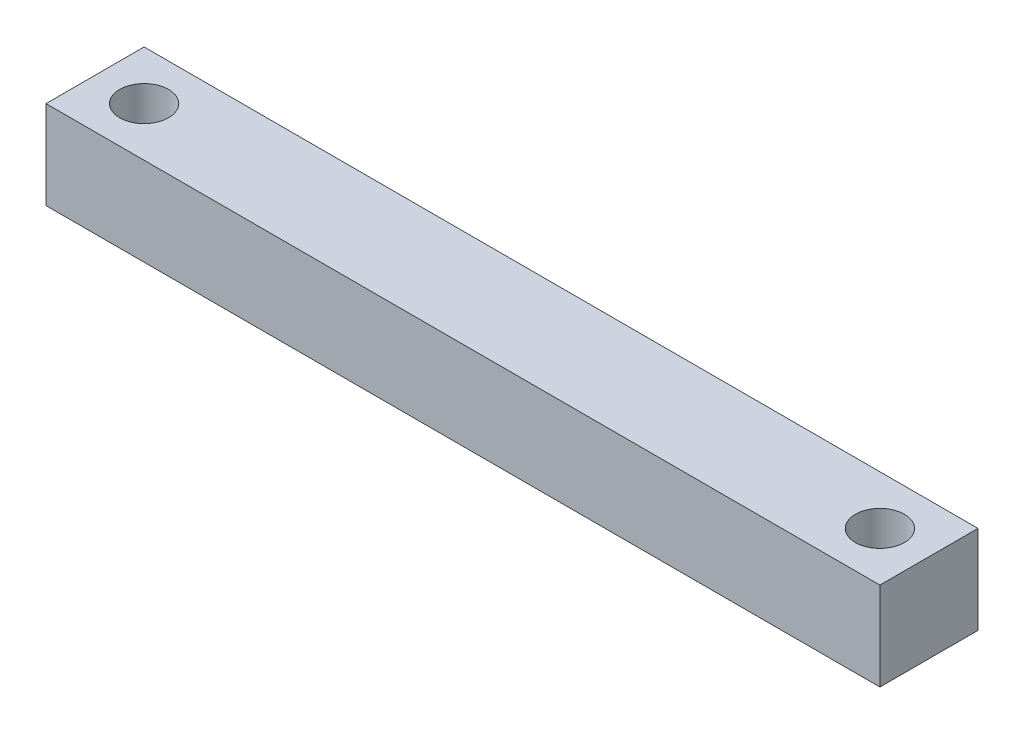
ISO-10303-21;
HEADER;
FILE_DESCRIPTION(('STEP AP214'),'2;1');
FILE_NAME('part.step','',(''),(''),'','','');
FILE_SCHEMA(('AUTOMOTIVE_DESIGN { 1 0 10303 214 1 1 1 1 }'));
ENDSEC;
DATA;
#1=APPLICATION_CONTEXT('core data for automotive mechanical design processes');
#2=APPLICATION_PROTOCOL_DEFINITION('international standard','automotive_design',2000,#1);
#3=PRODUCT_CONTEXT('',#1,'mechanical');
#4=PRODUCT('Part','Part','',(#3));
#5=PRODUCT_RELATED_PRODUCT_CATEGORY('part','',(#4));
#6=PRODUCT_DEFINITION_FORMATION('','',#4);
#7=PRODUCT_DEFINITION_CONTEXT('part definition',#1,'design');
#8=PRODUCT_DEFINITION('design','',#6,#7);
#9=PRODUCT_DEFINITION_SHAPE('','',#8);
#10=(LENGTH_UNIT() NAMED_UNIT(*) SI_UNIT(.MILLI.,.METRE.));
#11=(NAMED_UNIT(*) PLANE_ANGLE_UNIT() SI_UNIT($,.RADIAN.));
#12=(NAMED_UNIT(*) SI_UNIT($,.STERADIAN.) SOLID_ANGLE_UNIT());
#13=UNCERTAINTY_MEASURE_WITH_UNIT(LENGTH_MEASURE(1.E-05),#10,'distance_accuracy_value','');
#14=(GEOMETRIC_REPRESENTATION_CONTEXT(3) GLOBAL_UNCERTAINTY_ASSIGNED_CONTEXT((#13)) GLOBAL_UNIT_ASSIGNED_CONTEXT((#10,
#11,#12)) REPRESENTATION_CONTEXT('',''));
#15=CARTESIAN_POINT('',(0.,0.,0.));
#16=DIRECTION('',(0.,0.,1.));
#17=DIRECTION('',(1.,0.,0.));
#18=AXIS2_PLACEMENT_3D('',#15,#16,#17);
#19=CARTESIAN_POINT('',(-42.5,9.00488900129855,-5.));
#20=DIRECTION('',(1.,0.,0.));
#21=DIRECTION('',(0.,0.,-1.));
#22=AXIS2_PLACEMENT_3D('',#19,#20,#21);
#23=PLANE('',#22);
#24=DIRECTION('',(0.,0.,1.));
#25=VECTOR('',#24,1.);
#26=CARTESIAN_POINT('',(-42.5,0.,-5.));
#27=LINE('',#26,#25);
#28=CARTESIAN_POINT('',(-42.5,0.,-5.));
#29=VERTEX_POINT('',#28);
#30=CARTESIAN_POINT('',(-42.5,0.,5.));
#31=VERTEX_POINT('',#30);
#32=EDGE_CURVE('E107',#29,#31,#27,.T.);
#33=ORIENTED_EDGE('',*,*,#32,.T.);
#34=DIRECTION('',(0.,-1.,0.));
#35=VECTOR('',#34,1.);
#36=CARTESIAN_POINT('',(-42.5,9.00488900129855,5.));
#37=LINE('',#36,#35);
#38=CARTESIAN_POINT('',(-42.5,9.00488900129855,5.));
#39=VERTEX_POINT('',#38);
#40=EDGE_CURVE('E11',#39,#31,#37,.T.);
#41=ORIENTED_EDGE('',*,*,#40,.F.);
#42=DIRECTION('',(0.,0.,1.));
#43=VECTOR('',#42,1.);
#44=CARTESIAN_POINT('',(-42.5,9.00488900129855,-5.));
#45=LINE('',#44,#43);
#46=CARTESIAN_POINT('',(-42.5,9.00488900129855,-5.));
#47=VERTEX_POINT('',#46);
#48=EDGE_CURVE('E91',#47,#39,#45,.T.);
#49=ORIENTED_EDGE('',*,*,#48,.F.);
#50=DIRECTION('',(0.,-1.,0.));
#51=VECTOR('',#50,1.);
#52=CARTESIAN_POINT('',(-42.5,9.00488900129855,-5.));
#53=LINE('',#52,#51);
#54=EDGE_CURVE('E103',#47,#29,#53,.T.);
#55=ORIENTED_EDGE('',*,*,#54,.T.);
#56=EDGE_LOOP('',(#33,#41,#49,#55));
#57=FACE_BOUND('',#56,.T.);
#58=ADVANCED_FACE('F39',(#57),#23,.F.);
#59=CARTESIAN_POINT('',(-42.5,9.00488900129855,5.));
#60=DIRECTION('',(0.,0.,-1.));
#61=DIRECTION('',(-1.,0.,0.));
#62=AXIS2_PLACEMENT_3D('',#59,#60,#61);
#63=PLANE('',#62);
#64=DIRECTION('',(1.,0.,0.));
#65=VECTOR('',#64,1.);
#66=CARTESIAN_POINT('',(-42.5,0.,5.));
#67=LINE('',#66,#65);
#68=CARTESIAN_POINT('',(42.5,0.,5.));
#69=VERTEX_POINT('',#68);
#70=EDGE_CURVE('E96',#31,#69,#67,.T.);
#71=ORIENTED_EDGE('',*,*,#70,.T.);
#72=DIRECTION('',(0.,-1.,0.));
#73=VECTOR('',#72,1.);
#74=CARTESIAN_POINT('',(42.5,9.00488900129855,5.));
#75=LINE('',#74,#73);
#76=CARTESIAN_POINT('',(42.5,9.00488900129855,5.));
#77=VERTEX_POINT('',#76);
#78=EDGE_CURVE('E48',#77,#69,#75,.T.);
#79=ORIENTED_EDGE('',*,*,#78,.F.);
#80=DIRECTION('',(1.,0.,0.));
#81=VECTOR('',#80,1.);
#82=CARTESIAN_POINT('',(-42.5,9.00488900129855,5.));
#83=LINE('',#82,#81);
#84=EDGE_CURVE('E86',#39,#77,#83,.T.);
#85=ORIENTED_EDGE('',*,*,#84,.F.);
#86=ORIENTED_EDGE('',*,*,#40,.T.);
#87=EDGE_LOOP('',(#71,#79,#85,#86));
#88=FACE_BOUND('',#87,.T.);
#89=ADVANCED_FACE('F95',(#88),#63,.F.);
#90=CARTESIAN_POINT('',(42.5,9.00488900129855,-5.));
#91=DIRECTION('',(-1.,0.,0.));
#92=DIRECTION('',(0.,0.,1.));
#93=AXIS2_PLACEMENT_3D('',#90,#91,#92);
#94=PLANE('',#93);
#95=DIRECTION('',(0.,0.,-1.));
#96=VECTOR('',#95,1.);
#97=CARTESIAN_POINT('',(42.5,0.,-5.));
#98=LINE('',#97,#96);
#99=CARTESIAN_POINT('',(42.5,0.,-5.));
#100=VERTEX_POINT('',#99);
#101=EDGE_CURVE('E73',#69,#100,#98,.T.);
#102=ORIENTED_EDGE('',*,*,#101,.T.);
#103=DIRECTION('',(0.,-1.,0.));
#104=VECTOR('',#103,1.);
#105=CARTESIAN_POINT('',(42.5,9.00488900129855,-5.));
#106=LINE('',#105,#104);
#107=CARTESIAN_POINT('',(42.5,9.00488900129855,-5.));
#108=VERTEX_POINT('',#107);
#109=EDGE_CURVE('E98',#108,#100,#106,.T.);
#110=ORIENTED_EDGE('',*,*,#109,.F.);
#111=DIRECTION('',(0.,0.,-1.));
#112=VECTOR('',#111,1.);
#113=CARTESIAN_POINT('',(42.5,9.00488900129855,-5.));
#114=LINE('',#113,#112);
#115=EDGE_CURVE('E89',#77,#108,#114,.T.);
#116=ORIENTED_EDGE('',*,*,#115,.F.);
#117=ORIENTED_EDGE('',*,*,#78,.T.);
#118=EDGE_LOOP('',(#102,#110,#116,#117));
#119=FACE_BOUND('',#118,.T.);
#120=ADVANCED_FACE('F99',(#119),#94,.F.);
#121=CARTESIAN_POINT('',(-42.5,9.00488900129855,-5.));
#122=DIRECTION('',(0.,0.,1.));
#123=DIRECTION('',(1.,0.,0.));
#124=AXIS2_PLACEMENT_3D('',#121,#122,#123);
#125=PLANE('',#124);
#126=DIRECTION('',(-1.,0.,0.));
#127=VECTOR('',#126,1.);
#128=CARTESIAN_POINT('',(-42.5,0.,-5.));
#129=LINE('',#128,#127);
#130=EDGE_CURVE('E79',#100,#29,#129,.T.);
#131=ORIENTED_EDGE('',*,*,#130,.T.);
#132=ORIENTED_EDGE('',*,*,#54,.F.);
#133=DIRECTION('',(-1.,0.,0.));
#134=VECTOR('',#133,1.);
#135=CARTESIAN_POINT('',(-42.5,9.00488900129855,-5.));
#136=LINE('',#135,#134);
#137=EDGE_CURVE('E56',#108,#47,#136,.T.);
#138=ORIENTED_EDGE('',*,*,#137,.F.);
#139=ORIENTED_EDGE('',*,*,#109,.T.);
#140=EDGE_LOOP('',(#131,#132,#138,#139));
#141=FACE_BOUND('',#140,.T.);
#142=ADVANCED_FACE('F121',(#141),#125,.F.);
#143=CARTESIAN_POINT('',(0.,9.00488900129855,0.));
#144=DIRECTION('',(0.,1.,0.));
#145=DIRECTION('',(0.,0.,1.));
#146=AXIS2_PLACEMENT_3D('',#143,#144,#145);
#147=PLANE('',#146);
#148=CARTESIAN_POINT('',(-37.5,9.00488900129855,0.));
#149=DIRECTION('',(0.,1.,0.));
#150=DIRECTION('',(0.,0.,1.));
#151=AXIS2_PLACEMENT_3D('',#148,#149,#150);
#152=CIRCLE('',#151,2.49999999999999);
#153=CARTESIAN_POINT('',(-37.5,9.00488900129855,2.49999999999999));
#154=VERTEX_POINT('',#153);
#155=EDGE_CURVE('E136',#154,#154,#152,.T.);
#156=ORIENTED_EDGE('',*,*,#155,.F.);
#157=EDGE_LOOP('',(#156));
#158=FACE_BOUND('',#157,.T.);
#159=CARTESIAN_POINT('',(37.5,9.00488900129855,0.));
#160=DIRECTION('',(0.,1.,0.));
#161=DIRECTION('',(0.,0.,1.));
#162=AXIS2_PLACEMENT_3D('',#159,#160,#161);
#163=CIRCLE('',#162,2.49999999999999);
#164=CARTESIAN_POINT('',(37.5,9.00488900129855,2.49999999999999));
#165=VERTEX_POINT('',#164);
#166=EDGE_CURVE('E128',#165,#165,#163,.T.);
#167=ORIENTED_EDGE('',*,*,#166,.F.);
#168=EDGE_LOOP('',(#167));
#169=FACE_BOUND('',#168,.T.);
#170=ORIENTED_EDGE('',*,*,#48,.T.);
#171=ORIENTED_EDGE('',*,*,#84,.T.);
#172=ORIENTED_EDGE('',*,*,#115,.T.);
#173=ORIENTED_EDGE('',*,*,#137,.T.);
#174=EDGE_LOOP('',(#170,#171,#172,#173));
#175=FACE_BOUND('',#174,.T.);
#176=ADVANCED_FACE('F87',(#158,#169,#175),#147,.T.);
#177=CARTESIAN_POINT('',(0.,0.,0.));
#178=DIRECTION('',(0.,1.,0.));
#179=DIRECTION('',(0.,0.,1.));
#180=AXIS2_PLACEMENT_3D('',#177,#178,#179);
#181=PLANE('',#180);
#182=CARTESIAN_POINT('',(-37.5,0.,0.));
#183=DIRECTION('',(0.,1.,0.));
#184=DIRECTION('',(0.,0.,1.));
#185=AXIS2_PLACEMENT_3D('',#182,#183,#184);
#186=CIRCLE('',#185,2.49999999999999);
#187=CARTESIAN_POINT('',(-37.5,0.,2.49999999999999));
#188=VERTEX_POINT('',#187);
#189=EDGE_CURVE('E111',#188,#188,#186,.T.);
#190=ORIENTED_EDGE('',*,*,#189,.T.);
#191=EDGE_LOOP('',(#190));
#192=FACE_BOUND('',#191,.T.);
#193=CARTESIAN_POINT('',(37.5,0.,0.));
#194=DIRECTION('',(0.,1.,0.));
#195=DIRECTION('',(0.,0.,1.));
#196=AXIS2_PLACEMENT_3D('',#193,#194,#195);
#197=CIRCLE('',#196,2.49999999999999);
#198=CARTESIAN_POINT('',(37.5,0.,2.49999999999999));
#199=VERTEX_POINT('',#198);
#200=EDGE_CURVE('E132',#199,#199,#197,.T.);
#201=ORIENTED_EDGE('',*,*,#200,.T.);
#202=EDGE_LOOP('',(#201));
#203=FACE_BOUND('',#202,.T.);
#204=ORIENTED_EDGE('',*,*,#32,.F.);
#205=ORIENTED_EDGE('',*,*,#130,.F.);
#206=ORIENTED_EDGE('',*,*,#101,.F.);
#207=ORIENTED_EDGE('',*,*,#70,.F.);
#208=EDGE_LOOP('',(#204,#205,#206,#207));
#209=FACE_BOUND('',#208,.T.);
#210=ADVANCED_FACE('F124',(#192,#203,#209),#181,.F.);
#211=CARTESIAN_POINT('',(37.5,0.,0.));
#212=DIRECTION('',(0.,1.,0.));
#213=DIRECTION('',(0.,0.,1.));
#214=AXIS2_PLACEMENT_3D('',#211,#212,#213);
#215=CYLINDRICAL_SURFACE('',#214,2.49999999999999);
#216=ORIENTED_EDGE('',*,*,#200,.F.);
#217=EDGE_LOOP('',(#216));
#218=FACE_BOUND('',#217,.T.);
#219=ORIENTED_EDGE('',*,*,#166,.T.);
#220=EDGE_LOOP('',(#219));
#221=FACE_BOUND('',#220,.T.);
#222=ADVANCED_FACE('F149',(#218,#221),#215,.F.);
#223=CARTESIAN_POINT('',(-37.5,0.,0.));
#224=DIRECTION('',(0.,1.,0.));
#225=DIRECTION('',(0.,0.,1.));
#226=AXIS2_PLACEMENT_3D('',#223,#224,#225);
#227=CYLINDRICAL_SURFACE('',#226,2.49999999999999);
#228=ORIENTED_EDGE('',*,*,#189,.F.);
#229=EDGE_LOOP('',(#228));
#230=FACE_BOUND('',#229,.T.);
#231=ORIENTED_EDGE('',*,*,#155,.T.);
#232=EDGE_LOOP('',(#231));
#233=FACE_BOUND('',#232,.T.);
#234=ADVANCED_FACE('F146',(#230,#233),#227,.F.);
#235=CLOSED_SHELL('',(#58,#89,#120,#142,#176,#210,#222,#234));
#236=MANIFOLD_SOLID_BREP('B2',#235);
#237=ADVANCED_BREP_SHAPE_REPRESENTATION('',(#18,#236),#14);
#238=SHAPE_DEFINITION_REPRESENTATION(#9,#237);
ENDSEC;
END-ISO-10303-21;
